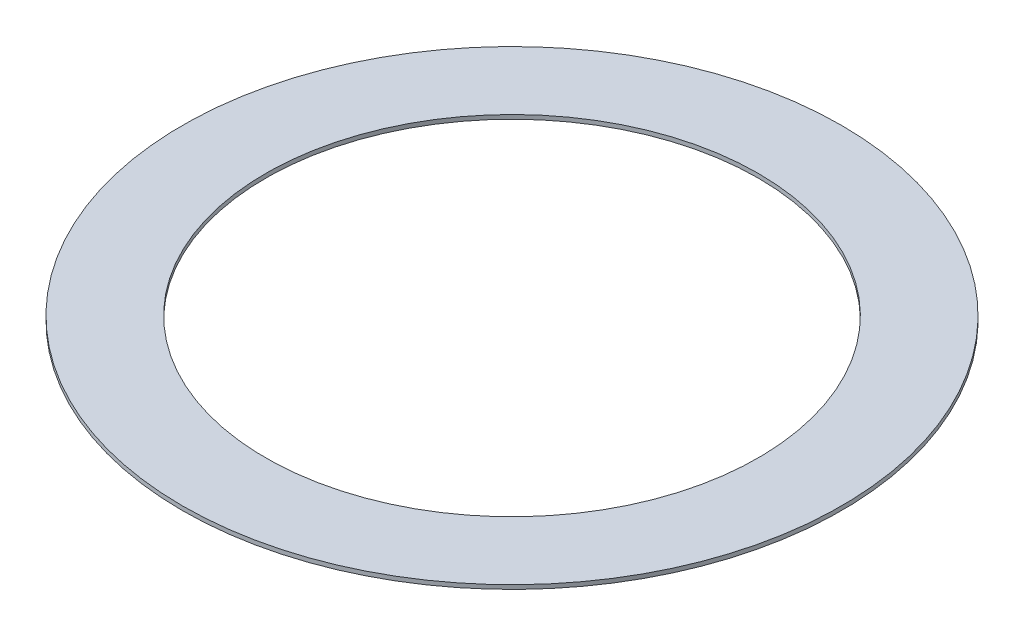
ISO-10303-21;
HEADER;
FILE_DESCRIPTION(('STEP AP214'),'2;1');
FILE_NAME('part.step','',(''),(''),'','','');
FILE_SCHEMA(('AUTOMOTIVE_DESIGN { 1 0 10303 214 1 1 1 1 }'));
ENDSEC;
DATA;
#1=APPLICATION_CONTEXT('core data for automotive mechanical design processes');
#2=APPLICATION_PROTOCOL_DEFINITION('international standard','automotive_design',2000,#1);
#3=PRODUCT_CONTEXT('',#1,'mechanical');
#4=PRODUCT('Part','Part','',(#3));
#5=PRODUCT_RELATED_PRODUCT_CATEGORY('part','',(#4));
#6=PRODUCT_DEFINITION_FORMATION('','',#4);
#7=PRODUCT_DEFINITION_CONTEXT('part definition',#1,'design');
#8=PRODUCT_DEFINITION('design','',#6,#7);
#9=PRODUCT_DEFINITION_SHAPE('','',#8);
#10=(LENGTH_UNIT() NAMED_UNIT(*) SI_UNIT(.MILLI.,.METRE.));
#11=(NAMED_UNIT(*) PLANE_ANGLE_UNIT() SI_UNIT($,.RADIAN.));
#12=(NAMED_UNIT(*) SI_UNIT($,.STERADIAN.) SOLID_ANGLE_UNIT());
#13=UNCERTAINTY_MEASURE_WITH_UNIT(LENGTH_MEASURE(1.E-05),#10,'distance_accuracy_value','');
#14=(GEOMETRIC_REPRESENTATION_CONTEXT(3) GLOBAL_UNCERTAINTY_ASSIGNED_CONTEXT((#13)) GLOBAL_UNIT_ASSIGNED_CONTEXT((#10,
#11,#12)) REPRESENTATION_CONTEXT('',''));
#15=CARTESIAN_POINT('',(0.,0.,0.));
#16=DIRECTION('',(0.,0.,1.));
#17=DIRECTION('',(1.,0.,0.));
#18=AXIS2_PLACEMENT_3D('',#15,#16,#17);
#19=CARTESIAN_POINT('',(0.,0.,0.));
#20=DIRECTION('',(0.,1.,0.));
#21=DIRECTION('',(0.,0.,1.));
#22=AXIS2_PLACEMENT_3D('',#19,#20,#21);
#23=PLANE('',#22);
#24=CARTESIAN_POINT('',(0.,0.,0.));
#25=DIRECTION('',(0.,-1.,0.));
#26=DIRECTION('',(0.,0.,-1.));
#27=AXIS2_PLACEMENT_3D('',#24,#25,#26);
#28=CIRCLE('',#27,7.5946);
#29=CARTESIAN_POINT('',(0.,0.,-7.5946));
#30=VERTEX_POINT('',#29);
#31=EDGE_CURVE('E26',#30,#30,#28,.F.);
#32=ORIENTED_EDGE('',*,*,#31,.T.);
#33=EDGE_LOOP('',(#32));
#34=FACE_BOUND('',#33,.T.);
#35=CARTESIAN_POINT('',(0.,0.,0.));
#36=DIRECTION('',(0.,-1.,0.));
#37=DIRECTION('',(0.,0.,-1.));
#38=AXIS2_PLACEMENT_3D('',#35,#36,#37);
#39=CIRCLE('',#38,10.16);
#40=CARTESIAN_POINT('',(0.,0.,-10.16));
#41=VERTEX_POINT('',#40);
#42=EDGE_CURVE('E17',#41,#41,#39,.F.);
#43=ORIENTED_EDGE('',*,*,#42,.F.);
#44=EDGE_LOOP('',(#43));
#45=FACE_BOUND('',#44,.T.);
#46=ADVANCED_FACE('F14',(#34,#45),#23,.F.);
#47=CARTESIAN_POINT('',(0.,0.127,0.));
#48=DIRECTION('',(0.,-1.,0.));
#49=DIRECTION('',(0.,0.,-1.));
#50=AXIS2_PLACEMENT_3D('',#47,#48,#49);
#51=CYLINDRICAL_SURFACE('',#50,10.16);
#52=ORIENTED_EDGE('',*,*,#42,.T.);
#53=EDGE_LOOP('',(#52));
#54=FACE_BOUND('',#53,.T.);
#55=CARTESIAN_POINT('',(0.,0.127,0.));
#56=DIRECTION('',(0.,-1.,0.));
#57=DIRECTION('',(0.,0.,-1.));
#58=AXIS2_PLACEMENT_3D('',#55,#56,#57);
#59=CIRCLE('',#58,10.16);
#60=CARTESIAN_POINT('',(0.,0.127,-10.16));
#61=VERTEX_POINT('',#60);
#62=EDGE_CURVE('E21',#61,#61,#59,.F.);
#63=ORIENTED_EDGE('',*,*,#62,.F.);
#64=EDGE_LOOP('',(#63));
#65=FACE_BOUND('',#64,.T.);
#66=ADVANCED_FACE('F34',(#54,#65),#51,.T.);
#67=CARTESIAN_POINT('',(0.,0.127,0.));
#68=DIRECTION('',(0.,-1.,0.));
#69=DIRECTION('',(0.,0.,-1.));
#70=AXIS2_PLACEMENT_3D('',#67,#68,#69);
#71=CYLINDRICAL_SURFACE('',#70,7.5946);
#72=CARTESIAN_POINT('',(0.,0.127,0.));
#73=DIRECTION('',(0.,-1.,0.));
#74=DIRECTION('',(0.,0.,-1.));
#75=AXIS2_PLACEMENT_3D('',#72,#73,#74);
#76=CIRCLE('',#75,7.5946);
#77=CARTESIAN_POINT('',(0.,0.127,-7.5946));
#78=VERTEX_POINT('',#77);
#79=EDGE_CURVE('E10',#78,#78,#76,.T.);
#80=ORIENTED_EDGE('',*,*,#79,.F.);
#81=EDGE_LOOP('',(#80));
#82=FACE_BOUND('',#81,.T.);
#83=ORIENTED_EDGE('',*,*,#31,.F.);
#84=EDGE_LOOP('',(#83));
#85=FACE_BOUND('',#84,.T.);
#86=ADVANCED_FACE('F42',(#82,#85),#71,.F.);
#87=CARTESIAN_POINT('',(0.,0.127,0.));
#88=DIRECTION('',(0.,1.,0.));
#89=DIRECTION('',(0.,0.,1.));
#90=AXIS2_PLACEMENT_3D('',#87,#88,#89);
#91=PLANE('',#90);
#92=ORIENTED_EDGE('',*,*,#79,.T.);
#93=EDGE_LOOP('',(#92));
#94=FACE_BOUND('',#93,.T.);
#95=ORIENTED_EDGE('',*,*,#62,.T.);
#96=EDGE_LOOP('',(#95));
#97=FACE_BOUND('',#96,.T.);
#98=ADVANCED_FACE('F43',(#94,#97),#91,.T.);
#99=CLOSED_SHELL('',(#46,#66,#86,#98));
#100=MANIFOLD_SOLID_BREP('B1',#99);
#101=ADVANCED_BREP_SHAPE_REPRESENTATION('',(#18,#100),#14);
#102=SHAPE_DEFINITION_REPRESENTATION(#9,#101);
ENDSEC;
END-ISO-10303-21;
